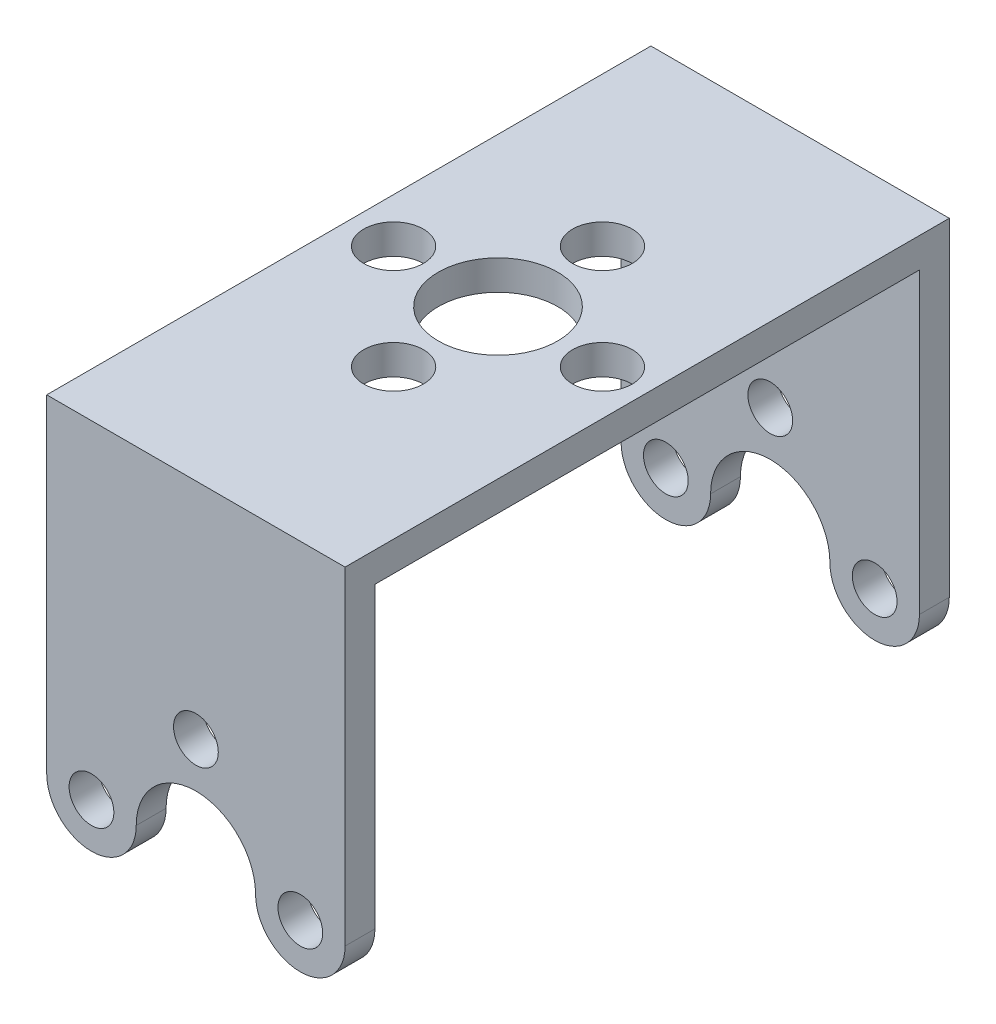
ISO-10303-21;
HEADER;
FILE_DESCRIPTION(('STEP AP214'),'2;1');
FILE_NAME('part.step','',(''),(''),'','','');
FILE_SCHEMA(('AUTOMOTIVE_DESIGN { 1 0 10303 214 1 1 1 1 }'));
ENDSEC;
DATA;
#1=APPLICATION_CONTEXT('core data for automotive mechanical design processes');
#2=APPLICATION_PROTOCOL_DEFINITION('international standard','automotive_design',2000,#1);
#3=PRODUCT_CONTEXT('',#1,'mechanical');
#4=PRODUCT('Part','Part','',(#3));
#5=PRODUCT_RELATED_PRODUCT_CATEGORY('part','',(#4));
#6=PRODUCT_DEFINITION_FORMATION('','',#4);
#7=PRODUCT_DEFINITION_CONTEXT('part definition',#1,'design');
#8=PRODUCT_DEFINITION('design','',#6,#7);
#9=PRODUCT_DEFINITION_SHAPE('','',#8);
#10=(LENGTH_UNIT() NAMED_UNIT(*) SI_UNIT(.MILLI.,.METRE.));
#11=(NAMED_UNIT(*) PLANE_ANGLE_UNIT() SI_UNIT($,.RADIAN.));
#12=(NAMED_UNIT(*) SI_UNIT($,.STERADIAN.) SOLID_ANGLE_UNIT());
#13=UNCERTAINTY_MEASURE_WITH_UNIT(LENGTH_MEASURE(1.E-05),#10,'distance_accuracy_value','');
#14=(GEOMETRIC_REPRESENTATION_CONTEXT(3) GLOBAL_UNCERTAINTY_ASSIGNED_CONTEXT((#13)) GLOBAL_UNIT_ASSIGNED_CONTEXT((#10,
#11,#12)) REPRESENTATION_CONTEXT('',''));
#15=CARTESIAN_POINT('',(0.,0.,0.));
#16=DIRECTION('',(0.,0.,1.));
#17=DIRECTION('',(1.,0.,0.));
#18=AXIS2_PLACEMENT_3D('',#15,#16,#17);
#19=CARTESIAN_POINT('',(-18.5930541020414,17.6508601907293,2.));
#20=DIRECTION('',(0.,0.,-1.));
#21=DIRECTION('',(-1.,0.,0.));
#22=AXIS2_PLACEMENT_3D('',#19,#20,#21);
#23=PLANE('',#22);
#24=CARTESIAN_POINT('',(-10.5930541020414,4.65086019072931,2.));
#25=DIRECTION('',(0.,0.,1.));
#26=DIRECTION('',(1.,0.,0.));
#27=AXIS2_PLACEMENT_3D('',#24,#25,#26);
#28=CIRCLE('',#27,1.5);
#29=CARTESIAN_POINT('',(-9.09305410204139,4.65086019072931,2.));
#30=VERTEX_POINT('',#29);
#31=EDGE_CURVE('E281',#30,#30,#28,.T.);
#32=ORIENTED_EDGE('',*,*,#31,.F.);
#33=EDGE_LOOP('',(#32));
#34=FACE_BOUND('',#33,.T.);
#35=CARTESIAN_POINT('',(-3.59305410204139,-2.34913980927068,2.));
#36=DIRECTION('',(0.,0.,1.));
#37=DIRECTION('',(1.,0.,0.));
#38=AXIS2_PLACEMENT_3D('',#35,#36,#37);
#39=CIRCLE('',#38,1.5);
#40=CARTESIAN_POINT('',(-2.09305410204139,-2.34913980927068,2.));
#41=VERTEX_POINT('',#40);
#42=EDGE_CURVE('E290',#41,#41,#39,.T.);
#43=ORIENTED_EDGE('',*,*,#42,.F.);
#44=EDGE_LOOP('',(#43));
#45=FACE_BOUND('',#44,.T.);
#46=CARTESIAN_POINT('',(-17.5930541020414,-2.3491398092707,2.));
#47=DIRECTION('',(0.,0.,1.));
#48=DIRECTION('',(1.,0.,0.));
#49=AXIS2_PLACEMENT_3D('',#46,#47,#48);
#50=CIRCLE('',#49,1.5);
#51=CARTESIAN_POINT('',(-16.0930541020414,-2.3491398092707,2.));
#52=VERTEX_POINT('',#51);
#53=EDGE_CURVE('E291',#52,#52,#50,.T.);
#54=ORIENTED_EDGE('',*,*,#53,.F.);
#55=EDGE_LOOP('',(#54));
#56=FACE_BOUND('',#55,.T.);
#57=DIRECTION('',(1.,0.,0.));
#58=VECTOR('',#57,1.);
#59=CARTESIAN_POINT('',(-18.5930541020414,17.6508601907293,2.));
#60=LINE('',#59,#58);
#61=CARTESIAN_POINT('',(-20.5930541020415,17.6508601907293,2.00000000000002));
#62=VERTEX_POINT('',#61);
#63=CARTESIAN_POINT('',(-0.593054102041462,17.6508601907293,2.00000000000002));
#64=VERTEX_POINT('',#63);
#65=EDGE_CURVE('E12',#62,#64,#60,.T.);
#66=ORIENTED_EDGE('',*,*,#65,.F.);
#67=DIRECTION('',(0.,-1.,0.));
#68=VECTOR('',#67,1.);
#69=CARTESIAN_POINT('',(-20.5930541020414,17.6508601907293,2.));
#70=LINE('',#69,#68);
#71=CARTESIAN_POINT('',(-20.5930541020414,-2.3491398092707,2.));
#72=VERTEX_POINT('',#71);
#73=EDGE_CURVE('E142',#62,#72,#70,.T.);
#74=ORIENTED_EDGE('',*,*,#73,.T.);
#75=CARTESIAN_POINT('',(-17.5930541020414,-2.3491398092707,2.));
#76=DIRECTION('',(0.,0.,1.));
#77=DIRECTION('',(1.,0.,0.));
#78=AXIS2_PLACEMENT_3D('',#75,#76,#77);
#79=CIRCLE('',#78,3.);
#80=CARTESIAN_POINT('',(-14.5930541020414,-2.3491398092707,2.));
#81=VERTEX_POINT('',#80);
#82=EDGE_CURVE('E306',#72,#81,#79,.T.);
#83=ORIENTED_EDGE('',*,*,#82,.T.);
#84=CARTESIAN_POINT('',(-10.5930541020414,-2.34913980927069,2.));
#85=DIRECTION('',(0.,0.,1.));
#86=DIRECTION('',(1.,0.,0.));
#87=AXIS2_PLACEMENT_3D('',#84,#85,#86);
#88=CIRCLE('',#87,4.);
#89=CARTESIAN_POINT('',(-6.59305410204139,-2.34913980927071,2.));
#90=VERTEX_POINT('',#89);
#91=EDGE_CURVE('E302',#90,#81,#88,.T.);
#92=ORIENTED_EDGE('',*,*,#91,.F.);
#93=CARTESIAN_POINT('',(-3.59305410204139,-2.34913980927067,2.));
#94=DIRECTION('',(0.,0.,-1.));
#95=DIRECTION('',(-1.,0.,0.));
#96=AXIS2_PLACEMENT_3D('',#93,#94,#95);
#97=CIRCLE('',#96,2.99999999999999);
#98=CARTESIAN_POINT('',(-0.593054102041399,-2.34913980927064,2.));
#99=VERTEX_POINT('',#98);
#100=EDGE_CURVE('E305',#99,#90,#97,.T.);
#101=ORIENTED_EDGE('',*,*,#100,.F.);
#102=DIRECTION('',(0.,-1.,0.));
#103=VECTOR('',#102,1.);
#104=CARTESIAN_POINT('',(-0.593054102041403,17.6508601907293,2.));
#105=LINE('',#104,#103);
#106=EDGE_CURVE('E299',#64,#99,#105,.T.);
#107=ORIENTED_EDGE('',*,*,#106,.F.);
#108=EDGE_LOOP('',(#66,#74,#83,#92,#101,#107));
#109=FACE_BOUND('',#108,.T.);
#110=ADVANCED_FACE('F125',(#34,#45,#56,#109),#23,.F.);
#111=CARTESIAN_POINT('',(-18.5930541020414,17.6508601907293,0.));
#112=DIRECTION('',(0.,0.,-1.));
#113=DIRECTION('',(-1.,0.,0.));
#114=AXIS2_PLACEMENT_3D('',#111,#112,#113);
#115=PLANE('',#114);
#116=DIRECTION('',(0.,-1.,0.));
#117=VECTOR('',#116,1.);
#118=CARTESIAN_POINT('',(-20.5930541020414,17.6508601907293,0.));
#119=LINE('',#118,#117);
#120=CARTESIAN_POINT('',(-20.5930541020415,19.6508601907293,0.));
#121=VERTEX_POINT('',#120);
#122=CARTESIAN_POINT('',(-20.5930541020414,-2.3491398092707,0.));
#123=VERTEX_POINT('',#122);
#124=EDGE_CURVE('E168',#121,#123,#119,.T.);
#125=ORIENTED_EDGE('',*,*,#124,.F.);
#126=DIRECTION('',(1.,0.,0.));
#127=VECTOR('',#126,1.);
#128=CARTESIAN_POINT('',(-18.5930541020414,19.6508601907293,0.));
#129=LINE('',#128,#127);
#130=CARTESIAN_POINT('',(-0.593054102041462,19.6508601907293,0.));
#131=VERTEX_POINT('',#130);
#132=EDGE_CURVE('E298',#121,#131,#129,.T.);
#133=ORIENTED_EDGE('',*,*,#132,.T.);
#134=DIRECTION('',(0.,-1.,0.));
#135=VECTOR('',#134,1.);
#136=CARTESIAN_POINT('',(-0.593054102041403,17.6508601907293,0.));
#137=LINE('',#136,#135);
#138=CARTESIAN_POINT('',(-0.593054102041399,-2.34913980927064,0.));
#139=VERTEX_POINT('',#138);
#140=EDGE_CURVE('E233',#131,#139,#137,.T.);
#141=ORIENTED_EDGE('',*,*,#140,.T.);
#142=CARTESIAN_POINT('',(-3.59305410204139,-2.34913980927067,0.));
#143=DIRECTION('',(0.,0.,-1.));
#144=DIRECTION('',(-1.,0.,0.));
#145=AXIS2_PLACEMENT_3D('',#142,#143,#144);
#146=CIRCLE('',#145,2.99999999999999);
#147=CARTESIAN_POINT('',(-6.59305410204139,-2.34913980927071,0.));
#148=VERTEX_POINT('',#147);
#149=EDGE_CURVE('E311',#139,#148,#146,.T.);
#150=ORIENTED_EDGE('',*,*,#149,.T.);
#151=CARTESIAN_POINT('',(-10.5930541020414,-2.34913980927069,0.));
#152=DIRECTION('',(0.,0.,1.));
#153=DIRECTION('',(1.,0.,0.));
#154=AXIS2_PLACEMENT_3D('',#151,#152,#153);
#155=CIRCLE('',#154,4.);
#156=CARTESIAN_POINT('',(-14.5930541020414,-2.3491398092707,0.));
#157=VERTEX_POINT('',#156);
#158=EDGE_CURVE('E313',#148,#157,#155,.T.);
#159=ORIENTED_EDGE('',*,*,#158,.T.);
#160=CARTESIAN_POINT('',(-17.5930541020414,-2.3491398092707,0.));
#161=DIRECTION('',(0.,0.,1.));
#162=DIRECTION('',(1.,0.,0.));
#163=AXIS2_PLACEMENT_3D('',#160,#161,#162);
#164=CIRCLE('',#163,3.);
#165=EDGE_CURVE('E320',#123,#157,#164,.T.);
#166=ORIENTED_EDGE('',*,*,#165,.F.);
#167=EDGE_LOOP('',(#125,#133,#141,#150,#159,#166));
#168=FACE_BOUND('',#167,.T.);
#169=CARTESIAN_POINT('',(-3.59305410204139,-2.34913980927068,0.));
#170=DIRECTION('',(0.,0.,1.));
#171=DIRECTION('',(1.,0.,0.));
#172=AXIS2_PLACEMENT_3D('',#169,#170,#171);
#173=CIRCLE('',#172,1.5);
#174=CARTESIAN_POINT('',(-2.09305410204139,-2.34913980927068,0.));
#175=VERTEX_POINT('',#174);
#176=EDGE_CURVE('E283',#175,#175,#173,.T.);
#177=ORIENTED_EDGE('',*,*,#176,.T.);
#178=EDGE_LOOP('',(#177));
#179=FACE_BOUND('',#178,.T.);
#180=CARTESIAN_POINT('',(-17.5930541020414,-2.3491398092707,0.));
#181=DIRECTION('',(0.,0.,1.));
#182=DIRECTION('',(1.,0.,0.));
#183=AXIS2_PLACEMENT_3D('',#180,#181,#182);
#184=CIRCLE('',#183,1.5);
#185=CARTESIAN_POINT('',(-16.0930541020414,-2.3491398092707,0.));
#186=VERTEX_POINT('',#185);
#187=EDGE_CURVE('E289',#186,#186,#184,.T.);
#188=ORIENTED_EDGE('',*,*,#187,.T.);
#189=EDGE_LOOP('',(#188));
#190=FACE_BOUND('',#189,.T.);
#191=CARTESIAN_POINT('',(-10.5930541020414,4.65086019072931,0.));
#192=DIRECTION('',(0.,0.,1.));
#193=DIRECTION('',(1.,0.,0.));
#194=AXIS2_PLACEMENT_3D('',#191,#192,#193);
#195=CIRCLE('',#194,1.5);
#196=CARTESIAN_POINT('',(-9.09305410204139,4.65086019072931,0.));
#197=VERTEX_POINT('',#196);
#198=EDGE_CURVE('E276',#197,#197,#195,.T.);
#199=ORIENTED_EDGE('',*,*,#198,.T.);
#200=EDGE_LOOP('',(#199));
#201=FACE_BOUND('',#200,.T.);
#202=ADVANCED_FACE('F399',(#168,#179,#190,#201),#115,.T.);
#203=CARTESIAN_POINT('',(-20.5930541020414,17.6508601907293,2.));
#204=DIRECTION('',(1.,0.,0.));
#205=DIRECTION('',(0.,1.,0.));
#206=AXIS2_PLACEMENT_3D('',#203,#204,#205);
#207=PLANE('',#206);
#208=ORIENTED_EDGE('',*,*,#124,.T.);
#209=DIRECTION('',(0.,0.,-1.));
#210=VECTOR('',#209,1.);
#211=CARTESIAN_POINT('',(-20.5930541020414,-2.3491398092707,2.));
#212=LINE('',#211,#210);
#213=EDGE_CURVE('E132',#72,#123,#212,.T.);
#214=ORIENTED_EDGE('',*,*,#213,.F.);
#215=ORIENTED_EDGE('',*,*,#73,.F.);
#216=DIRECTION('',(0.,0.,1.));
#217=VECTOR('',#216,1.);
#218=CARTESIAN_POINT('',(-20.5930541020415,17.6508601907293,20.25));
#219=LINE('',#218,#217);
#220=CARTESIAN_POINT('',(-20.5930541020415,17.6508601907293,38.5));
#221=VERTEX_POINT('',#220);
#222=EDGE_CURVE('E280',#62,#221,#219,.T.);
#223=ORIENTED_EDGE('',*,*,#222,.T.);
#224=DIRECTION('',(0.,-1.,0.));
#225=VECTOR('',#224,1.);
#226=CARTESIAN_POINT('',(-20.5930541020414,17.6508601907293,38.5));
#227=LINE('',#226,#225);
#228=CARTESIAN_POINT('',(-20.5930541020414,-2.3491398092707,38.5));
#229=VERTEX_POINT('',#228);
#230=EDGE_CURVE('E272',#221,#229,#227,.T.);
#231=ORIENTED_EDGE('',*,*,#230,.T.);
#232=DIRECTION('',(0.,0.,1.));
#233=VECTOR('',#232,1.);
#234=CARTESIAN_POINT('',(-20.5930541020414,-2.3491398092707,38.5));
#235=LINE('',#234,#233);
#236=CARTESIAN_POINT('',(-20.5930541020414,-2.3491398092707,40.5));
#237=VERTEX_POINT('',#236);
#238=EDGE_CURVE('E264',#229,#237,#235,.T.);
#239=ORIENTED_EDGE('',*,*,#238,.T.);
#240=DIRECTION('',(0.,-1.,0.));
#241=VECTOR('',#240,1.);
#242=CARTESIAN_POINT('',(-20.5930541020414,17.6508601907293,40.5));
#243=LINE('',#242,#241);
#244=CARTESIAN_POINT('',(-20.5930541020415,19.6508601907293,40.5));
#245=VERTEX_POINT('',#244);
#246=EDGE_CURVE('E257',#245,#237,#243,.T.);
#247=ORIENTED_EDGE('',*,*,#246,.F.);
#248=DIRECTION('',(0.,0.,1.));
#249=VECTOR('',#248,1.);
#250=CARTESIAN_POINT('',(-20.5930541020415,19.6508601907293,20.25));
#251=LINE('',#250,#249);
#252=EDGE_CURVE('E232',#121,#245,#251,.T.);
#253=ORIENTED_EDGE('',*,*,#252,.F.);
#254=EDGE_LOOP('',(#208,#214,#215,#223,#231,#239,#247,#253));
#255=FACE_BOUND('',#254,.T.);
#256=ADVANCED_FACE('F374',(#255),#207,.F.);
#257=CARTESIAN_POINT('',(-17.5930541020414,-2.3491398092707,2.));
#258=DIRECTION('',(0.,0.,-1.));
#259=DIRECTION('',(-1.,0.,0.));
#260=AXIS2_PLACEMENT_3D('',#257,#258,#259);
#261=CYLINDRICAL_SURFACE('',#260,3.);
#262=ORIENTED_EDGE('',*,*,#165,.T.);
#263=DIRECTION('',(0.,0.,-1.));
#264=VECTOR('',#263,1.);
#265=CARTESIAN_POINT('',(-14.5930541020414,-2.3491398092707,2.));
#266=LINE('',#265,#264);
#267=EDGE_CURVE('E158',#81,#157,#266,.T.);
#268=ORIENTED_EDGE('',*,*,#267,.F.);
#269=ORIENTED_EDGE('',*,*,#82,.F.);
#270=ORIENTED_EDGE('',*,*,#213,.T.);
#271=EDGE_LOOP('',(#262,#268,#269,#270));
#272=FACE_BOUND('',#271,.T.);
#273=ADVANCED_FACE('F395',(#272),#261,.T.);
#274=CARTESIAN_POINT('',(-10.5930541020414,-2.34913980927069,2.));
#275=DIRECTION('',(0.,0.,-1.));
#276=DIRECTION('',(-1.,0.,0.));
#277=AXIS2_PLACEMENT_3D('',#274,#275,#276);
#278=CYLINDRICAL_SURFACE('',#277,4.);
#279=ORIENTED_EDGE('',*,*,#158,.F.);
#280=DIRECTION('',(0.,0.,-1.));
#281=VECTOR('',#280,1.);
#282=CARTESIAN_POINT('',(-6.59305410204139,-2.34913980927071,2.));
#283=LINE('',#282,#281);
#284=EDGE_CURVE('E325',#90,#148,#283,.T.);
#285=ORIENTED_EDGE('',*,*,#284,.F.);
#286=ORIENTED_EDGE('',*,*,#91,.T.);
#287=ORIENTED_EDGE('',*,*,#267,.T.);
#288=EDGE_LOOP('',(#279,#285,#286,#287));
#289=FACE_BOUND('',#288,.T.);
#290=ADVANCED_FACE('F397',(#289),#278,.F.);
#291=CARTESIAN_POINT('',(-3.59305410204139,-2.34913980927067,2.));
#292=DIRECTION('',(0.,0.,-1.));
#293=DIRECTION('',(-1.,0.,0.));
#294=AXIS2_PLACEMENT_3D('',#291,#292,#293);
#295=CYLINDRICAL_SURFACE('',#294,2.99999999999999);
#296=ORIENTED_EDGE('',*,*,#149,.F.);
#297=DIRECTION('',(0.,0.,-1.));
#298=VECTOR('',#297,1.);
#299=CARTESIAN_POINT('',(-0.593054102041399,-2.34913980927064,2.));
#300=LINE('',#299,#298);
#301=EDGE_CURVE('E173',#99,#139,#300,.T.);
#302=ORIENTED_EDGE('',*,*,#301,.F.);
#303=ORIENTED_EDGE('',*,*,#100,.T.);
#304=ORIENTED_EDGE('',*,*,#284,.T.);
#305=EDGE_LOOP('',(#296,#302,#303,#304));
#306=FACE_BOUND('',#305,.T.);
#307=ADVANCED_FACE('F400',(#306),#295,.T.);
#308=CARTESIAN_POINT('',(-0.593054102041403,17.6508601907293,2.));
#309=DIRECTION('',(1.,0.,0.));
#310=DIRECTION('',(0.,0.,-1.));
#311=AXIS2_PLACEMENT_3D('',#308,#309,#310);
#312=PLANE('',#311);
#313=ORIENTED_EDGE('',*,*,#140,.F.);
#314=DIRECTION('',(0.,0.,-1.));
#315=VECTOR('',#314,1.);
#316=CARTESIAN_POINT('',(-0.59305410204146,19.6508601907293,20.25));
#317=LINE('',#316,#315);
#318=CARTESIAN_POINT('',(-0.593054102041462,19.6508601907293,40.5));
#319=VERTEX_POINT('',#318);
#320=EDGE_CURVE('E223',#319,#131,#317,.T.);
#321=ORIENTED_EDGE('',*,*,#320,.F.);
#322=DIRECTION('',(0.,-1.,0.));
#323=VECTOR('',#322,1.);
#324=CARTESIAN_POINT('',(-0.593054102041403,17.6508601907293,40.5));
#325=LINE('',#324,#323);
#326=CARTESIAN_POINT('',(-0.593054102041399,-2.34913980927064,40.5));
#327=VERTEX_POINT('',#326);
#328=EDGE_CURVE('E226',#319,#327,#325,.T.);
#329=ORIENTED_EDGE('',*,*,#328,.T.);
#330=DIRECTION('',(0.,0.,1.));
#331=VECTOR('',#330,1.);
#332=CARTESIAN_POINT('',(-0.593054102041399,-2.34913980927064,38.5));
#333=LINE('',#332,#331);
#334=CARTESIAN_POINT('',(-0.593054102041399,-2.34913980927064,38.5));
#335=VERTEX_POINT('',#334);
#336=EDGE_CURVE('E268',#335,#327,#333,.T.);
#337=ORIENTED_EDGE('',*,*,#336,.F.);
#338=DIRECTION('',(0.,-1.,0.));
#339=VECTOR('',#338,1.);
#340=CARTESIAN_POINT('',(-0.593054102041403,17.6508601907293,38.5));
#341=LINE('',#340,#339);
#342=CARTESIAN_POINT('',(-0.593054102041462,17.6508601907293,38.5));
#343=VERTEX_POINT('',#342);
#344=EDGE_CURVE('E262',#343,#335,#341,.T.);
#345=ORIENTED_EDGE('',*,*,#344,.F.);
#346=DIRECTION('',(0.,0.,-1.));
#347=VECTOR('',#346,1.);
#348=CARTESIAN_POINT('',(-0.59305410204146,17.6508601907293,20.25));
#349=LINE('',#348,#347);
#350=EDGE_CURVE('E274',#343,#64,#349,.T.);
#351=ORIENTED_EDGE('',*,*,#350,.T.);
#352=ORIENTED_EDGE('',*,*,#106,.T.);
#353=ORIENTED_EDGE('',*,*,#301,.T.);
#354=EDGE_LOOP('',(#313,#321,#329,#337,#345,#351,#352,#353));
#355=FACE_BOUND('',#354,.T.);
#356=ADVANCED_FACE('F228',(#355),#312,.T.);
#357=CARTESIAN_POINT('',(-18.5930541020414,19.6508601907293,2.));
#358=DIRECTION('',(0.,1.,0.));
#359=DIRECTION('',(0.,0.,1.));
#360=AXIS2_PLACEMENT_3D('',#357,#358,#359);
#361=PLANE('',#360);
#362=CARTESIAN_POINT('',(-10.5930541020415,19.6508601907293,27.25));
#363=DIRECTION('',(0.,1.,0.));
#364=DIRECTION('',(0.,0.,1.));
#365=AXIS2_PLACEMENT_3D('',#362,#363,#364);
#366=CIRCLE('',#365,2.);
#367=CARTESIAN_POINT('',(-10.5930541020415,19.6508601907293,29.25));
#368=VERTEX_POINT('',#367);
#369=EDGE_CURVE('E328',#368,#368,#366,.T.);
#370=ORIENTED_EDGE('',*,*,#369,.F.);
#371=EDGE_LOOP('',(#370));
#372=FACE_BOUND('',#371,.T.);
#373=CARTESIAN_POINT('',(-3.59305410204146,19.6508601907293,20.25));
#374=DIRECTION('',(0.,1.,0.));
#375=DIRECTION('',(0.,0.,1.));
#376=AXIS2_PLACEMENT_3D('',#373,#374,#375);
#377=CIRCLE('',#376,2.);
#378=CARTESIAN_POINT('',(-3.59305410204146,19.6508601907293,22.25));
#379=VERTEX_POINT('',#378);
#380=EDGE_CURVE('E460',#379,#379,#377,.T.);
#381=ORIENTED_EDGE('',*,*,#380,.F.);
#382=EDGE_LOOP('',(#381));
#383=FACE_BOUND('',#382,.T.);
#384=CARTESIAN_POINT('',(-10.5930541020415,19.6508601907293,13.25));
#385=DIRECTION('',(0.,1.,0.));
#386=DIRECTION('',(0.,0.,1.));
#387=AXIS2_PLACEMENT_3D('',#384,#385,#386);
#388=CIRCLE('',#387,2.);
#389=CARTESIAN_POINT('',(-10.5930541020415,19.6508601907293,15.25));
#390=VERTEX_POINT('',#389);
#391=EDGE_CURVE('E463',#390,#390,#388,.T.);
#392=ORIENTED_EDGE('',*,*,#391,.F.);
#393=EDGE_LOOP('',(#392));
#394=FACE_BOUND('',#393,.T.);
#395=CARTESIAN_POINT('',(-17.5930541020415,19.6508601907293,20.25));
#396=DIRECTION('',(0.,1.,0.));
#397=DIRECTION('',(0.,0.,1.));
#398=AXIS2_PLACEMENT_3D('',#395,#396,#397);
#399=CIRCLE('',#398,2.);
#400=CARTESIAN_POINT('',(-17.5930541020415,19.6508601907293,22.25));
#401=VERTEX_POINT('',#400);
#402=EDGE_CURVE('E466',#401,#401,#399,.T.);
#403=ORIENTED_EDGE('',*,*,#402,.F.);
#404=EDGE_LOOP('',(#403));
#405=FACE_BOUND('',#404,.T.);
#406=CARTESIAN_POINT('',(-10.5930541020415,19.6508601907293,20.25));
#407=DIRECTION('',(0.,1.,0.));
#408=DIRECTION('',(0.,0.,1.));
#409=AXIS2_PLACEMENT_3D('',#406,#407,#408);
#410=CIRCLE('',#409,4.);
#411=CARTESIAN_POINT('',(-10.5930541020415,19.6508601907293,24.25));
#412=VERTEX_POINT('',#411);
#413=EDGE_CURVE('E473',#412,#412,#410,.T.);
#414=ORIENTED_EDGE('',*,*,#413,.F.);
#415=EDGE_LOOP('',(#414));
#416=FACE_BOUND('',#415,.T.);
#417=ORIENTED_EDGE('',*,*,#132,.F.);
#418=ORIENTED_EDGE('',*,*,#252,.T.);
#419=DIRECTION('',(1.,0.,0.));
#420=VECTOR('',#419,1.);
#421=CARTESIAN_POINT('',(-18.5930541020414,19.6508601907293,40.5));
#422=LINE('',#421,#420);
#423=EDGE_CURVE('E237',#245,#319,#422,.T.);
#424=ORIENTED_EDGE('',*,*,#423,.T.);
#425=ORIENTED_EDGE('',*,*,#320,.T.);
#426=EDGE_LOOP('',(#417,#418,#424,#425));
#427=FACE_BOUND('',#426,.T.);
#428=ADVANCED_FACE('F121',(#372,#383,#394,#405,#416,#427),#361,.T.);
#429=CARTESIAN_POINT('',(-17.5930541020414,-2.3491398092707,2.));
#430=DIRECTION('',(0.,0.,-1.));
#431=DIRECTION('',(-1.,0.,0.));
#432=AXIS2_PLACEMENT_3D('',#429,#430,#431);
#433=CYLINDRICAL_SURFACE('',#432,1.5);
#434=ORIENTED_EDGE('',*,*,#53,.T.);
#435=EDGE_LOOP('',(#434));
#436=FACE_BOUND('',#435,.T.);
#437=ORIENTED_EDGE('',*,*,#187,.F.);
#438=EDGE_LOOP('',(#437));
#439=FACE_BOUND('',#438,.T.);
#440=ADVANCED_FACE('F423',(#436,#439),#433,.F.);
#441=CARTESIAN_POINT('',(-3.59305410204139,-2.34913980927068,2.));
#442=DIRECTION('',(0.,0.,-1.));
#443=DIRECTION('',(-1.,0.,0.));
#444=AXIS2_PLACEMENT_3D('',#441,#442,#443);
#445=CYLINDRICAL_SURFACE('',#444,1.5);
#446=ORIENTED_EDGE('',*,*,#42,.T.);
#447=EDGE_LOOP('',(#446));
#448=FACE_BOUND('',#447,.T.);
#449=ORIENTED_EDGE('',*,*,#176,.F.);
#450=EDGE_LOOP('',(#449));
#451=FACE_BOUND('',#450,.T.);
#452=ADVANCED_FACE('F412',(#448,#451),#445,.F.);
#453=CARTESIAN_POINT('',(-10.5930541020414,4.65086019072931,2.));
#454=DIRECTION('',(0.,0.,-1.));
#455=DIRECTION('',(-1.,0.,0.));
#456=AXIS2_PLACEMENT_3D('',#453,#454,#455);
#457=CYLINDRICAL_SURFACE('',#456,1.5);
#458=ORIENTED_EDGE('',*,*,#31,.T.);
#459=EDGE_LOOP('',(#458));
#460=FACE_BOUND('',#459,.T.);
#461=ORIENTED_EDGE('',*,*,#198,.F.);
#462=EDGE_LOOP('',(#461));
#463=FACE_BOUND('',#462,.T.);
#464=ADVANCED_FACE('F407',(#460,#463),#457,.F.);
#465=CARTESIAN_POINT('',(0.,17.6508601907293,0.));
#466=DIRECTION('',(0.,1.,0.));
#467=DIRECTION('',(0.,0.,1.));
#468=AXIS2_PLACEMENT_3D('',#465,#466,#467);
#469=PLANE('',#468);
#470=CARTESIAN_POINT('',(-10.5930541020415,17.6508601907293,27.25));
#471=DIRECTION('',(0.,1.,0.));
#472=DIRECTION('',(0.,0.,1.));
#473=AXIS2_PLACEMENT_3D('',#470,#471,#472);
#474=CIRCLE('',#473,2.);
#475=CARTESIAN_POINT('',(-10.5930541020415,17.6508601907293,29.25));
#476=VERTEX_POINT('',#475);
#477=EDGE_CURVE('E128',#476,#476,#474,.T.);
#478=ORIENTED_EDGE('',*,*,#477,.T.);
#479=EDGE_LOOP('',(#478));
#480=FACE_BOUND('',#479,.T.);
#481=CARTESIAN_POINT('',(-3.59305410204146,17.6508601907293,20.25));
#482=DIRECTION('',(0.,1.,0.));
#483=DIRECTION('',(0.,0.,1.));
#484=AXIS2_PLACEMENT_3D('',#481,#482,#483);
#485=CIRCLE('',#484,2.);
#486=CARTESIAN_POINT('',(-3.59305410204146,17.6508601907293,22.25));
#487=VERTEX_POINT('',#486);
#488=EDGE_CURVE('E333',#487,#487,#485,.T.);
#489=ORIENTED_EDGE('',*,*,#488,.T.);
#490=EDGE_LOOP('',(#489));
#491=FACE_BOUND('',#490,.T.);
#492=CARTESIAN_POINT('',(-10.5930541020415,17.6508601907293,13.25));
#493=DIRECTION('',(0.,1.,0.));
#494=DIRECTION('',(0.,0.,1.));
#495=AXIS2_PLACEMENT_3D('',#492,#493,#494);
#496=CIRCLE('',#495,2.);
#497=CARTESIAN_POINT('',(-10.5930541020415,17.6508601907293,15.25));
#498=VERTEX_POINT('',#497);
#499=EDGE_CURVE('E335',#498,#498,#496,.T.);
#500=ORIENTED_EDGE('',*,*,#499,.T.);
#501=EDGE_LOOP('',(#500));
#502=FACE_BOUND('',#501,.T.);
#503=CARTESIAN_POINT('',(-17.5930541020415,17.6508601907293,20.25));
#504=DIRECTION('',(0.,1.,0.));
#505=DIRECTION('',(0.,0.,1.));
#506=AXIS2_PLACEMENT_3D('',#503,#504,#505);
#507=CIRCLE('',#506,2.);
#508=CARTESIAN_POINT('',(-17.5930541020415,17.6508601907293,22.25));
#509=VERTEX_POINT('',#508);
#510=EDGE_CURVE('E329',#509,#509,#507,.T.);
#511=ORIENTED_EDGE('',*,*,#510,.T.);
#512=EDGE_LOOP('',(#511));
#513=FACE_BOUND('',#512,.T.);
#514=CARTESIAN_POINT('',(-10.5930541020415,17.6508601907293,20.25));
#515=DIRECTION('',(0.,1.,0.));
#516=DIRECTION('',(0.,0.,1.));
#517=AXIS2_PLACEMENT_3D('',#514,#515,#516);
#518=CIRCLE('',#517,4.);
#519=CARTESIAN_POINT('',(-10.5930541020415,17.6508601907293,24.25));
#520=VERTEX_POINT('',#519);
#521=EDGE_CURVE('E322',#520,#520,#518,.T.);
#522=ORIENTED_EDGE('',*,*,#521,.T.);
#523=EDGE_LOOP('',(#522));
#524=FACE_BOUND('',#523,.T.);
#525=ORIENTED_EDGE('',*,*,#222,.F.);
#526=ORIENTED_EDGE('',*,*,#65,.T.);
#527=ORIENTED_EDGE('',*,*,#350,.F.);
#528=DIRECTION('',(1.,0.,0.));
#529=VECTOR('',#528,1.);
#530=CARTESIAN_POINT('',(-18.5930541020414,17.6508601907293,38.5));
#531=LINE('',#530,#529);
#532=EDGE_CURVE('E236',#221,#343,#531,.T.);
#533=ORIENTED_EDGE('',*,*,#532,.F.);
#534=EDGE_LOOP('',(#525,#526,#527,#533));
#535=FACE_BOUND('',#534,.T.);
#536=ADVANCED_FACE('F391',(#480,#491,#502,#513,#524,#535),#469,.F.);
#537=CARTESIAN_POINT('',(-18.5930541020414,17.6508601907293,38.5));
#538=DIRECTION('',(0.,0.,1.));
#539=DIRECTION('',(-1.,0.,0.));
#540=AXIS2_PLACEMENT_3D('',#537,#538,#539);
#541=PLANE('',#540);
#542=CARTESIAN_POINT('',(-10.5930541020414,4.65086019072931,38.5));
#543=DIRECTION('',(0.,0.,1.));
#544=DIRECTION('',(1.,0.,0.));
#545=AXIS2_PLACEMENT_3D('',#542,#543,#544);
#546=CIRCLE('',#545,1.5);
#547=CARTESIAN_POINT('',(-9.09305410204139,4.65086019072931,38.5));
#548=VERTEX_POINT('',#547);
#549=EDGE_CURVE('E341',#548,#548,#546,.T.);
#550=ORIENTED_EDGE('',*,*,#549,.T.);
#551=EDGE_LOOP('',(#550));
#552=FACE_BOUND('',#551,.T.);
#553=CARTESIAN_POINT('',(-3.59305410204139,-2.34913980927068,38.5));
#554=DIRECTION('',(0.,0.,1.));
#555=DIRECTION('',(1.,0.,0.));
#556=AXIS2_PLACEMENT_3D('',#553,#554,#555);
#557=CIRCLE('',#556,1.5);
#558=CARTESIAN_POINT('',(-2.09305410204139,-2.34913980927068,38.5));
#559=VERTEX_POINT('',#558);
#560=EDGE_CURVE('E355',#559,#559,#557,.T.);
#561=ORIENTED_EDGE('',*,*,#560,.T.);
#562=EDGE_LOOP('',(#561));
#563=FACE_BOUND('',#562,.T.);
#564=CARTESIAN_POINT('',(-17.5930541020414,-2.3491398092707,38.5));
#565=DIRECTION('',(0.,0.,1.));
#566=DIRECTION('',(1.,0.,0.));
#567=AXIS2_PLACEMENT_3D('',#564,#565,#566);
#568=CIRCLE('',#567,1.5);
#569=CARTESIAN_POINT('',(-16.0930541020414,-2.3491398092707,38.5));
#570=VERTEX_POINT('',#569);
#571=EDGE_CURVE('E243',#570,#570,#568,.T.);
#572=ORIENTED_EDGE('',*,*,#571,.T.);
#573=EDGE_LOOP('',(#572));
#574=FACE_BOUND('',#573,.T.);
#575=ORIENTED_EDGE('',*,*,#532,.T.);
#576=ORIENTED_EDGE('',*,*,#344,.T.);
#577=CARTESIAN_POINT('',(-3.59305410204139,-2.34913980927067,38.5));
#578=DIRECTION('',(0.,0.,-1.));
#579=DIRECTION('',(-1.,0.,0.));
#580=AXIS2_PLACEMENT_3D('',#577,#578,#579);
#581=CIRCLE('',#580,2.99999999999999);
#582=CARTESIAN_POINT('',(-6.59305410204139,-2.34913980927071,38.5));
#583=VERTEX_POINT('',#582);
#584=EDGE_CURVE('E364',#335,#583,#581,.T.);
#585=ORIENTED_EDGE('',*,*,#584,.T.);
#586=CARTESIAN_POINT('',(-10.5930541020414,-2.34913980927069,38.5));
#587=DIRECTION('',(0.,0.,1.));
#588=DIRECTION('',(1.,0.,0.));
#589=AXIS2_PLACEMENT_3D('',#586,#587,#588);
#590=CIRCLE('',#589,4.);
#591=CARTESIAN_POINT('',(-14.5930541020414,-2.3491398092707,38.5));
#592=VERTEX_POINT('',#591);
#593=EDGE_CURVE('E370',#583,#592,#590,.T.);
#594=ORIENTED_EDGE('',*,*,#593,.T.);
#595=CARTESIAN_POINT('',(-17.5930541020414,-2.3491398092707,38.5));
#596=DIRECTION('',(0.,0.,1.));
#597=DIRECTION('',(1.,0.,0.));
#598=AXIS2_PLACEMENT_3D('',#595,#596,#597);
#599=CIRCLE('',#598,3.);
#600=EDGE_CURVE('E369',#229,#592,#599,.T.);
#601=ORIENTED_EDGE('',*,*,#600,.F.);
#602=ORIENTED_EDGE('',*,*,#230,.F.);
#603=EDGE_LOOP('',(#575,#576,#585,#594,#601,#602));
#604=FACE_BOUND('',#603,.T.);
#605=ADVANCED_FACE('F378',(#552,#563,#574,#604),#541,.F.);
#606=CARTESIAN_POINT('',(-18.5930541020414,17.6508601907293,40.5));
#607=DIRECTION('',(0.,0.,1.));
#608=DIRECTION('',(-1.,0.,0.));
#609=AXIS2_PLACEMENT_3D('',#606,#607,#608);
#610=PLANE('',#609);
#611=ORIENTED_EDGE('',*,*,#246,.T.);
#612=CARTESIAN_POINT('',(-17.5930541020414,-2.3491398092707,40.5));
#613=DIRECTION('',(0.,0.,1.));
#614=DIRECTION('',(1.,0.,0.));
#615=AXIS2_PLACEMENT_3D('',#612,#613,#614);
#616=CIRCLE('',#615,3.);
#617=CARTESIAN_POINT('',(-14.5930541020414,-2.3491398092707,40.5));
#618=VERTEX_POINT('',#617);
#619=EDGE_CURVE('E260',#237,#618,#616,.T.);
#620=ORIENTED_EDGE('',*,*,#619,.T.);
#621=CARTESIAN_POINT('',(-10.5930541020414,-2.34913980927069,40.5));
#622=DIRECTION('',(0.,0.,1.));
#623=DIRECTION('',(1.,0.,0.));
#624=AXIS2_PLACEMENT_3D('',#621,#622,#623);
#625=CIRCLE('',#624,4.);
#626=CARTESIAN_POINT('',(-6.59305410204139,-2.34913980927071,40.5));
#627=VERTEX_POINT('',#626);
#628=EDGE_CURVE('E252',#627,#618,#625,.T.);
#629=ORIENTED_EDGE('',*,*,#628,.F.);
#630=CARTESIAN_POINT('',(-3.59305410204139,-2.34913980927067,40.5));
#631=DIRECTION('',(0.,0.,-1.));
#632=DIRECTION('',(-1.,0.,0.));
#633=AXIS2_PLACEMENT_3D('',#630,#631,#632);
#634=CIRCLE('',#633,2.99999999999999);
#635=EDGE_CURVE('E248',#327,#627,#634,.T.);
#636=ORIENTED_EDGE('',*,*,#635,.F.);
#637=ORIENTED_EDGE('',*,*,#328,.F.);
#638=ORIENTED_EDGE('',*,*,#423,.F.);
#639=EDGE_LOOP('',(#611,#620,#629,#636,#637,#638));
#640=FACE_BOUND('',#639,.T.);
#641=CARTESIAN_POINT('',(-3.59305410204139,-2.34913980927068,40.5));
#642=DIRECTION('',(0.,0.,1.));
#643=DIRECTION('',(1.,0.,0.));
#644=AXIS2_PLACEMENT_3D('',#641,#642,#643);
#645=CIRCLE('',#644,1.5);
#646=CARTESIAN_POINT('',(-2.09305410204139,-2.34913980927068,40.5));
#647=VERTEX_POINT('',#646);
#648=EDGE_CURVE('E349',#647,#647,#645,.T.);
#649=ORIENTED_EDGE('',*,*,#648,.F.);
#650=EDGE_LOOP('',(#649));
#651=FACE_BOUND('',#650,.T.);
#652=CARTESIAN_POINT('',(-17.5930541020414,-2.3491398092707,40.5));
#653=DIRECTION('',(0.,0.,1.));
#654=DIRECTION('',(1.,0.,0.));
#655=AXIS2_PLACEMENT_3D('',#652,#653,#654);
#656=CIRCLE('',#655,1.5);
#657=CARTESIAN_POINT('',(-16.0930541020414,-2.3491398092707,40.5));
#658=VERTEX_POINT('',#657);
#659=EDGE_CURVE('E354',#658,#658,#656,.T.);
#660=ORIENTED_EDGE('',*,*,#659,.F.);
#661=EDGE_LOOP('',(#660));
#662=FACE_BOUND('',#661,.T.);
#663=CARTESIAN_POINT('',(-10.5930541020414,4.65086019072931,40.5));
#664=DIRECTION('',(0.,0.,1.));
#665=DIRECTION('',(1.,0.,0.));
#666=AXIS2_PLACEMENT_3D('',#663,#664,#665);
#667=CIRCLE('',#666,1.5);
#668=CARTESIAN_POINT('',(-9.09305410204139,4.65086019072931,40.5));
#669=VERTEX_POINT('',#668);
#670=EDGE_CURVE('E339',#669,#669,#667,.T.);
#671=ORIENTED_EDGE('',*,*,#670,.F.);
#672=EDGE_LOOP('',(#671));
#673=FACE_BOUND('',#672,.T.);
#674=ADVANCED_FACE('F244',(#640,#651,#662,#673),#610,.T.);
#675=CARTESIAN_POINT('',(-17.5930541020414,-2.3491398092707,38.5));
#676=DIRECTION('',(0.,0.,1.));
#677=DIRECTION('',(-1.,0.,0.));
#678=AXIS2_PLACEMENT_3D('',#675,#676,#677);
#679=CYLINDRICAL_SURFACE('',#678,3.);
#680=ORIENTED_EDGE('',*,*,#619,.F.);
#681=ORIENTED_EDGE('',*,*,#238,.F.);
#682=ORIENTED_EDGE('',*,*,#600,.T.);
#683=DIRECTION('',(0.,0.,1.));
#684=VECTOR('',#683,1.);
#685=CARTESIAN_POINT('',(-14.5930541020414,-2.3491398092707,38.5));
#686=LINE('',#685,#684);
#687=EDGE_CURVE('E265',#592,#618,#686,.T.);
#688=ORIENTED_EDGE('',*,*,#687,.T.);
#689=EDGE_LOOP('',(#680,#681,#682,#688));
#690=FACE_BOUND('',#689,.T.);
#691=ADVANCED_FACE('F385',(#690),#679,.T.);
#692=CARTESIAN_POINT('',(-10.5930541020414,-2.34913980927069,38.5));
#693=DIRECTION('',(0.,0.,1.));
#694=DIRECTION('',(-1.,0.,0.));
#695=AXIS2_PLACEMENT_3D('',#692,#693,#694);
#696=CYLINDRICAL_SURFACE('',#695,4.);
#697=ORIENTED_EDGE('',*,*,#628,.T.);
#698=ORIENTED_EDGE('',*,*,#687,.F.);
#699=ORIENTED_EDGE('',*,*,#593,.F.);
#700=DIRECTION('',(0.,0.,1.));
#701=VECTOR('',#700,1.);
#702=CARTESIAN_POINT('',(-6.59305410204139,-2.34913980927071,38.5));
#703=LINE('',#702,#701);
#704=EDGE_CURVE('E270',#583,#627,#703,.T.);
#705=ORIENTED_EDGE('',*,*,#704,.T.);
#706=EDGE_LOOP('',(#697,#698,#699,#705));
#707=FACE_BOUND('',#706,.T.);
#708=ADVANCED_FACE('F381',(#707),#696,.F.);
#709=CARTESIAN_POINT('',(-3.59305410204139,-2.34913980927067,38.5));
#710=DIRECTION('',(0.,0.,1.));
#711=DIRECTION('',(-1.,0.,0.));
#712=AXIS2_PLACEMENT_3D('',#709,#710,#711);
#713=CYLINDRICAL_SURFACE('',#712,2.99999999999999);
#714=ORIENTED_EDGE('',*,*,#635,.T.);
#715=ORIENTED_EDGE('',*,*,#704,.F.);
#716=ORIENTED_EDGE('',*,*,#584,.F.);
#717=ORIENTED_EDGE('',*,*,#336,.T.);
#718=EDGE_LOOP('',(#714,#715,#716,#717));
#719=FACE_BOUND('',#718,.T.);
#720=ADVANCED_FACE('F390',(#719),#713,.T.);
#721=CARTESIAN_POINT('',(-17.5930541020414,-2.3491398092707,38.5));
#722=DIRECTION('',(0.,0.,1.));
#723=DIRECTION('',(-1.,0.,0.));
#724=AXIS2_PLACEMENT_3D('',#721,#722,#723);
#725=CYLINDRICAL_SURFACE('',#724,1.5);
#726=ORIENTED_EDGE('',*,*,#571,.F.);
#727=EDGE_LOOP('',(#726));
#728=FACE_BOUND('',#727,.T.);
#729=ORIENTED_EDGE('',*,*,#659,.T.);
#730=EDGE_LOOP('',(#729));
#731=FACE_BOUND('',#730,.T.);
#732=ADVANCED_FACE('F510',(#728,#731),#725,.F.);
#733=CARTESIAN_POINT('',(-3.59305410204139,-2.34913980927068,38.5));
#734=DIRECTION('',(0.,0.,1.));
#735=DIRECTION('',(-1.,0.,0.));
#736=AXIS2_PLACEMENT_3D('',#733,#734,#735);
#737=CYLINDRICAL_SURFACE('',#736,1.5);
#738=ORIENTED_EDGE('',*,*,#560,.F.);
#739=EDGE_LOOP('',(#738));
#740=FACE_BOUND('',#739,.T.);
#741=ORIENTED_EDGE('',*,*,#648,.T.);
#742=EDGE_LOOP('',(#741));
#743=FACE_BOUND('',#742,.T.);
#744=ADVANCED_FACE('F499',(#740,#743),#737,.F.);
#745=CARTESIAN_POINT('',(-10.5930541020414,4.65086019072931,38.5));
#746=DIRECTION('',(0.,0.,1.));
#747=DIRECTION('',(-1.,0.,0.));
#748=AXIS2_PLACEMENT_3D('',#745,#746,#747);
#749=CYLINDRICAL_SURFACE('',#748,1.5);
#750=ORIENTED_EDGE('',*,*,#549,.F.);
#751=EDGE_LOOP('',(#750));
#752=FACE_BOUND('',#751,.T.);
#753=ORIENTED_EDGE('',*,*,#670,.T.);
#754=EDGE_LOOP('',(#753));
#755=FACE_BOUND('',#754,.T.);
#756=ADVANCED_FACE('F491',(#752,#755),#749,.F.);
#757=CARTESIAN_POINT('',(-10.5930541020415,9.6508601907293,20.25));
#758=DIRECTION('',(0.,1.,0.));
#759=DIRECTION('',(0.,0.,1.));
#760=AXIS2_PLACEMENT_3D('',#757,#758,#759);
#761=CYLINDRICAL_SURFACE('',#760,4.);
#762=ORIENTED_EDGE('',*,*,#413,.T.);
#763=EDGE_LOOP('',(#762));
#764=FACE_BOUND('',#763,.T.);
#765=ORIENTED_EDGE('',*,*,#521,.F.);
#766=EDGE_LOOP('',(#765));
#767=FACE_BOUND('',#766,.T.);
#768=ADVANCED_FACE('F493',(#764,#767),#761,.F.);
#769=CARTESIAN_POINT('',(-17.5930541020415,9.6508601907293,20.25));
#770=DIRECTION('',(0.,1.,0.));
#771=DIRECTION('',(0.,0.,1.));
#772=AXIS2_PLACEMENT_3D('',#769,#770,#771);
#773=CYLINDRICAL_SURFACE('',#772,2.);
#774=ORIENTED_EDGE('',*,*,#402,.T.);
#775=EDGE_LOOP('',(#774));
#776=FACE_BOUND('',#775,.T.);
#777=ORIENTED_EDGE('',*,*,#510,.F.);
#778=EDGE_LOOP('',(#777));
#779=FACE_BOUND('',#778,.T.);
#780=ADVANCED_FACE('F485',(#776,#779),#773,.F.);
#781=CARTESIAN_POINT('',(-10.5930541020415,9.6508601907293,13.25));
#782=DIRECTION('',(0.,1.,0.));
#783=DIRECTION('',(0.,0.,1.));
#784=AXIS2_PLACEMENT_3D('',#781,#782,#783);
#785=CYLINDRICAL_SURFACE('',#784,2.);
#786=ORIENTED_EDGE('',*,*,#391,.T.);
#787=EDGE_LOOP('',(#786));
#788=FACE_BOUND('',#787,.T.);
#789=ORIENTED_EDGE('',*,*,#499,.F.);
#790=EDGE_LOOP('',(#789));
#791=FACE_BOUND('',#790,.T.);
#792=ADVANCED_FACE('F479',(#788,#791),#785,.F.);
#793=CARTESIAN_POINT('',(-3.59305410204146,9.6508601907293,20.25));
#794=DIRECTION('',(0.,1.,0.));
#795=DIRECTION('',(0.,0.,1.));
#796=AXIS2_PLACEMENT_3D('',#793,#794,#795);
#797=CYLINDRICAL_SURFACE('',#796,2.);
#798=ORIENTED_EDGE('',*,*,#380,.T.);
#799=EDGE_LOOP('',(#798));
#800=FACE_BOUND('',#799,.T.);
#801=ORIENTED_EDGE('',*,*,#488,.F.);
#802=EDGE_LOOP('',(#801));
#803=FACE_BOUND('',#802,.T.);
#804=ADVANCED_FACE('F481',(#800,#803),#797,.F.);
#805=CARTESIAN_POINT('',(-10.5930541020415,9.6508601907293,27.25));
#806=DIRECTION('',(0.,1.,0.));
#807=DIRECTION('',(0.,0.,1.));
#808=AXIS2_PLACEMENT_3D('',#805,#806,#807);
#809=CYLINDRICAL_SURFACE('',#808,2.);
#810=ORIENTED_EDGE('',*,*,#369,.T.);
#811=EDGE_LOOP('',(#810));
#812=FACE_BOUND('',#811,.T.);
#813=ORIENTED_EDGE('',*,*,#477,.F.);
#814=EDGE_LOOP('',(#813));
#815=FACE_BOUND('',#814,.T.);
#816=ADVANCED_FACE('F566',(#812,#815),#809,.F.);
#817=CLOSED_SHELL('',(#110,#202,#256,#273,#290,#307,#356,#428,#440,#452,#464,#536,#605,#674,
#691,#708,#720,#732,#744,#756,#768,#780,#792,#804,#816));
#818=MANIFOLD_SOLID_BREP('B2',#817);
#819=ADVANCED_BREP_SHAPE_REPRESENTATION('',(#18,#818),#14);
#820=SHAPE_DEFINITION_REPRESENTATION(#9,#819);
ENDSEC;
END-ISO-10303-21;
